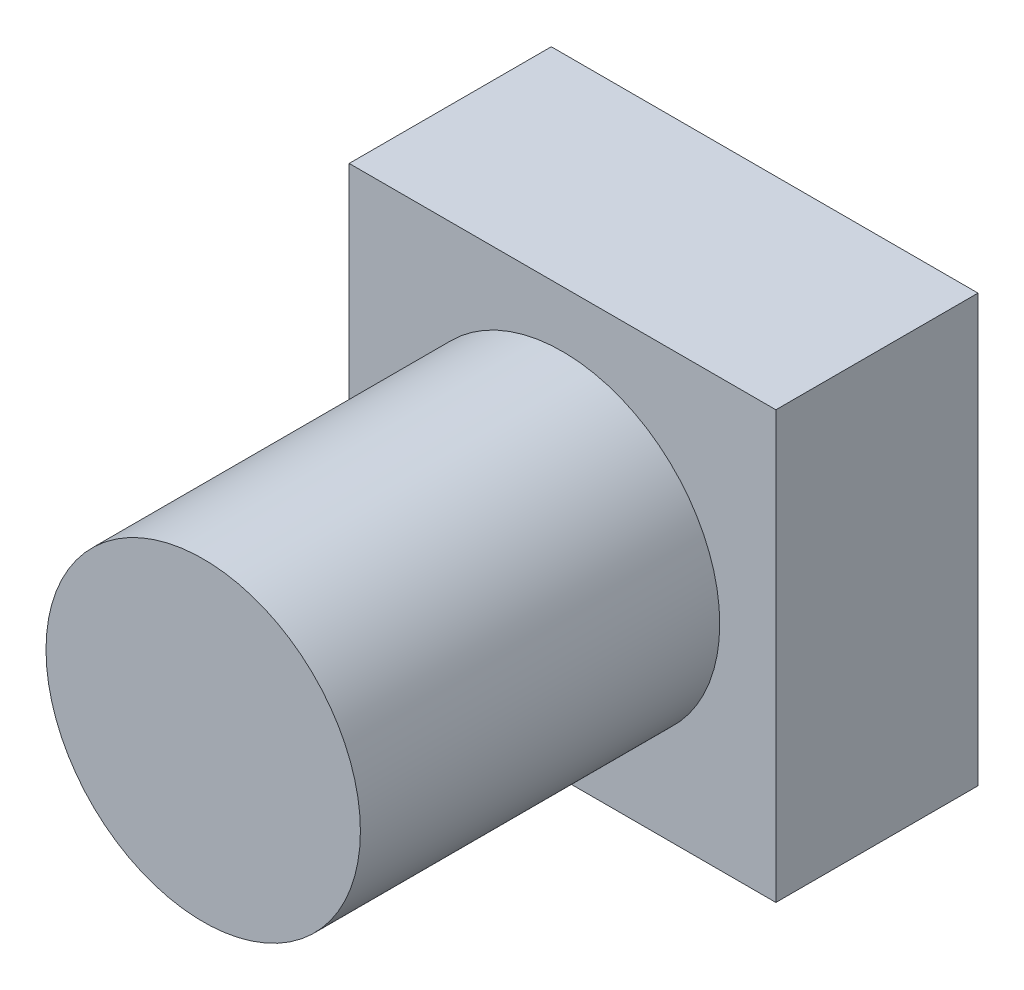
ISO-10303-21;
HEADER;
FILE_DESCRIPTION(('STEP AP214'),'2;1');
FILE_NAME('part.step','',(''),(''),'','','');
FILE_SCHEMA(('AUTOMOTIVE_DESIGN { 1 0 10303 214 1 1 1 1 }'));
ENDSEC;
DATA;
#1=APPLICATION_CONTEXT('core data for automotive mechanical design processes');
#2=APPLICATION_PROTOCOL_DEFINITION('international standard','automotive_design',2000,#1);
#3=PRODUCT_CONTEXT('',#1,'mechanical');
#4=PRODUCT('Part','Part','',(#3));
#5=PRODUCT_RELATED_PRODUCT_CATEGORY('part','',(#4));
#6=PRODUCT_DEFINITION_FORMATION('','',#4);
#7=PRODUCT_DEFINITION_CONTEXT('part definition',#1,'design');
#8=PRODUCT_DEFINITION('design','',#6,#7);
#9=PRODUCT_DEFINITION_SHAPE('','',#8);
#10=(LENGTH_UNIT() NAMED_UNIT(*) SI_UNIT(.MILLI.,.METRE.));
#11=(NAMED_UNIT(*) PLANE_ANGLE_UNIT() SI_UNIT($,.RADIAN.));
#12=(NAMED_UNIT(*) SI_UNIT($,.STERADIAN.) SOLID_ANGLE_UNIT());
#13=UNCERTAINTY_MEASURE_WITH_UNIT(LENGTH_MEASURE(1.E-05),#10,'distance_accuracy_value','');
#14=(GEOMETRIC_REPRESENTATION_CONTEXT(3) GLOBAL_UNCERTAINTY_ASSIGNED_CONTEXT((#13)) GLOBAL_UNIT_ASSIGNED_CONTEXT((#10,
#11,#12)) REPRESENTATION_CONTEXT('',''));
#15=CARTESIAN_POINT('',(0.,0.,0.));
#16=DIRECTION('',(0.,0.,1.));
#17=DIRECTION('',(1.,0.,0.));
#18=AXIS2_PLACEMENT_3D('',#15,#16,#17);
#19=CARTESIAN_POINT('',(0.,0.,9.));
#20=DIRECTION('',(0.,0.,1.));
#21=DIRECTION('',(1.,0.,0.));
#22=AXIS2_PLACEMENT_3D('',#19,#20,#21);
#23=PLANE('',#22);
#24=DIRECTION('',(-1.,0.,0.));
#25=VECTOR('',#24,1.);
#26=CARTESIAN_POINT('',(0.,-9.5,9.));
#27=LINE('',#26,#25);
#28=CARTESIAN_POINT('',(9.5,-9.5,9.));
#29=VERTEX_POINT('',#28);
#30=CARTESIAN_POINT('',(-9.5,-9.5,9.));
#31=VERTEX_POINT('',#30);
#32=EDGE_CURVE('P0_E11',#29,#31,#27,.T.);
#33=ORIENTED_EDGE('',*,*,#32,.F.);
#34=DIRECTION('',(0.,-1.,0.));
#35=VECTOR('',#34,1.);
#36=CARTESIAN_POINT('',(9.5,0.,9.));
#37=LINE('',#36,#35);
#38=CARTESIAN_POINT('',(9.5,9.5,9.));
#39=VERTEX_POINT('',#38);
#40=EDGE_CURVE('P0_E61',#39,#29,#37,.T.);
#41=ORIENTED_EDGE('',*,*,#40,.F.);
#42=DIRECTION('',(1.,0.,0.));
#43=VECTOR('',#42,1.);
#44=CARTESIAN_POINT('',(0.,9.5,9.));
#45=LINE('',#44,#43);
#46=CARTESIAN_POINT('',(-9.5,9.5,9.));
#47=VERTEX_POINT('',#46);
#48=EDGE_CURVE('P0_E87',#47,#39,#45,.T.);
#49=ORIENTED_EDGE('',*,*,#48,.F.);
#50=DIRECTION('',(0.,1.,0.));
#51=VECTOR('',#50,1.);
#52=CARTESIAN_POINT('',(-9.5,0.,9.));
#53=LINE('',#52,#51);
#54=EDGE_CURVE('P0_E24',#31,#47,#53,.T.);
#55=ORIENTED_EDGE('',*,*,#54,.F.);
#56=EDGE_LOOP('',(#33,#41,#49,#55));
#57=FACE_BOUND('',#56,.T.);
#58=ADVANCED_FACE('P0_F17',(#57),#23,.T.);
#59=CARTESIAN_POINT('',(0.,-9.5,0.));
#60=DIRECTION('',(0.,-1.,0.));
#61=DIRECTION('',(0.,0.,-1.));
#62=AXIS2_PLACEMENT_3D('',#59,#60,#61);
#63=PLANE('',#62);
#64=DIRECTION('',(0.,0.,1.));
#65=VECTOR('',#64,1.);
#66=CARTESIAN_POINT('',(9.5,-9.5,0.));
#67=LINE('',#66,#65);
#68=CARTESIAN_POINT('',(9.5,-9.5,0.));
#69=VERTEX_POINT('',#68);
#70=EDGE_CURVE('P0_E53',#69,#29,#67,.T.);
#71=ORIENTED_EDGE('',*,*,#70,.T.);
#72=ORIENTED_EDGE('',*,*,#32,.T.);
#73=DIRECTION('',(0.,0.,1.));
#74=VECTOR('',#73,1.);
#75=CARTESIAN_POINT('',(-9.5,-9.5,0.));
#76=LINE('',#75,#74);
#77=CARTESIAN_POINT('',(-9.5,-9.5,0.));
#78=VERTEX_POINT('',#77);
#79=EDGE_CURVE('P0_E70',#78,#31,#76,.T.);
#80=ORIENTED_EDGE('',*,*,#79,.F.);
#81=DIRECTION('',(1.,0.,0.));
#82=VECTOR('',#81,1.);
#83=CARTESIAN_POINT('',(0.,-9.5,0.));
#84=LINE('',#83,#82);
#85=EDGE_CURVE('P0_E65',#78,#69,#84,.T.);
#86=ORIENTED_EDGE('',*,*,#85,.T.);
#87=EDGE_LOOP('',(#71,#72,#80,#86));
#88=FACE_BOUND('',#87,.T.);
#89=ADVANCED_FACE('P0_F66',(#88),#63,.T.);
#90=CARTESIAN_POINT('',(-9.5,0.,0.));
#91=DIRECTION('',(-1.,0.,0.));
#92=DIRECTION('',(0.,0.,1.));
#93=AXIS2_PLACEMENT_3D('',#90,#91,#92);
#94=PLANE('',#93);
#95=ORIENTED_EDGE('',*,*,#79,.T.);
#96=ORIENTED_EDGE('',*,*,#54,.T.);
#97=DIRECTION('',(0.,0.,1.));
#98=VECTOR('',#97,1.);
#99=CARTESIAN_POINT('',(-9.5,9.5,0.));
#100=LINE('',#99,#98);
#101=CARTESIAN_POINT('',(-9.5,9.5,0.));
#102=VERTEX_POINT('',#101);
#103=EDGE_CURVE('P0_E85',#102,#47,#100,.T.);
#104=ORIENTED_EDGE('',*,*,#103,.F.);
#105=DIRECTION('',(0.,-1.,0.));
#106=VECTOR('',#105,1.);
#107=CARTESIAN_POINT('',(-9.5,0.,0.));
#108=LINE('',#107,#106);
#109=EDGE_CURVE('P0_E75',#102,#78,#108,.T.);
#110=ORIENTED_EDGE('',*,*,#109,.T.);
#111=EDGE_LOOP('',(#95,#96,#104,#110));
#112=FACE_BOUND('',#111,.T.);
#113=ADVANCED_FACE('P0_F93',(#112),#94,.T.);
#114=CARTESIAN_POINT('',(0.,9.5,0.));
#115=DIRECTION('',(0.,1.,0.));
#116=DIRECTION('',(0.,0.,1.));
#117=AXIS2_PLACEMENT_3D('',#114,#115,#116);
#118=PLANE('',#117);
#119=ORIENTED_EDGE('',*,*,#103,.T.);
#120=ORIENTED_EDGE('',*,*,#48,.T.);
#121=DIRECTION('',(0.,0.,1.));
#122=VECTOR('',#121,1.);
#123=CARTESIAN_POINT('',(9.5,9.5,0.));
#124=LINE('',#123,#122);
#125=CARTESIAN_POINT('',(9.5,9.5,0.));
#126=VERTEX_POINT('',#125);
#127=EDGE_CURVE('P0_E62',#126,#39,#124,.T.);
#128=ORIENTED_EDGE('',*,*,#127,.F.);
#129=DIRECTION('',(-1.,0.,0.));
#130=VECTOR('',#129,1.);
#131=CARTESIAN_POINT('',(0.,9.5,0.));
#132=LINE('',#131,#130);
#133=EDGE_CURVE('P0_E76',#126,#102,#132,.T.);
#134=ORIENTED_EDGE('',*,*,#133,.T.);
#135=EDGE_LOOP('',(#119,#120,#128,#134));
#136=FACE_BOUND('',#135,.T.);
#137=ADVANCED_FACE('P0_F90',(#136),#118,.T.);
#138=CARTESIAN_POINT('',(0.,0.,0.));
#139=DIRECTION('',(0.,0.,-1.));
#140=DIRECTION('',(-1.,0.,0.));
#141=AXIS2_PLACEMENT_3D('',#138,#139,#140);
#142=PLANE('',#141);
#143=DIRECTION('',(0.,1.,0.));
#144=VECTOR('',#143,1.);
#145=CARTESIAN_POINT('',(9.5,0.,0.));
#146=LINE('',#145,#144);
#147=EDGE_CURVE('P0_E56',#69,#126,#146,.T.);
#148=ORIENTED_EDGE('',*,*,#147,.F.);
#149=ORIENTED_EDGE('',*,*,#85,.F.);
#150=ORIENTED_EDGE('',*,*,#109,.F.);
#151=ORIENTED_EDGE('',*,*,#133,.F.);
#152=EDGE_LOOP('',(#148,#149,#150,#151));
#153=FACE_BOUND('',#152,.T.);
#154=ADVANCED_FACE('P0_F72',(#153),#142,.T.);
#155=CARTESIAN_POINT('',(9.5,0.,0.));
#156=DIRECTION('',(1.,0.,0.));
#157=DIRECTION('',(0.,0.,-1.));
#158=AXIS2_PLACEMENT_3D('',#155,#156,#157);
#159=PLANE('',#158);
#160=ORIENTED_EDGE('',*,*,#147,.T.);
#161=ORIENTED_EDGE('',*,*,#127,.T.);
#162=ORIENTED_EDGE('',*,*,#40,.T.);
#163=ORIENTED_EDGE('',*,*,#70,.F.);
#164=EDGE_LOOP('',(#160,#161,#162,#163));
#165=FACE_BOUND('',#164,.T.);
#166=ADVANCED_FACE('P0_F57',(#165),#159,.T.);
#167=CLOSED_SHELL('',(#58,#89,#113,#137,#154,#166));
#168=MANIFOLD_SOLID_BREP('P0_B1',#167);
#169=CARTESIAN_POINT('',(0.,0.,25.));
#170=DIRECTION('',(0.,0.,1.));
#171=DIRECTION('',(1.,0.,0.));
#172=AXIS2_PLACEMENT_3D('',#169,#170,#171);
#173=PLANE('',#172);
#174=CARTESIAN_POINT('',(0.,0.,25.));
#175=DIRECTION('',(0.,0.,-1.));
#176=DIRECTION('',(-1.,0.,0.));
#177=AXIS2_PLACEMENT_3D('',#174,#175,#176);
#178=CIRCLE('',#177,7.);
#179=CARTESIAN_POINT('',(-7.,0.,25.));
#180=VERTEX_POINT('',#179);
#181=EDGE_CURVE('P1_E10',#180,#180,#178,.T.);
#182=ORIENTED_EDGE('',*,*,#181,.F.);
#183=EDGE_LOOP('',(#182));
#184=FACE_BOUND('',#183,.T.);
#185=ADVANCED_FACE('P1_F15',(#184),#173,.T.);
#186=CARTESIAN_POINT('',(0.,0.,9.));
#187=DIRECTION('',(0.,0.,-1.));
#188=DIRECTION('',(-1.,0.,0.));
#189=AXIS2_PLACEMENT_3D('',#186,#187,#188);
#190=PLANE('',#189);
#191=CARTESIAN_POINT('',(0.,0.,9.));
#192=DIRECTION('',(0.,0.,1.));
#193=DIRECTION('',(1.,0.,0.));
#194=AXIS2_PLACEMENT_3D('',#191,#192,#193);
#195=CIRCLE('',#194,7.);
#196=CARTESIAN_POINT('',(7.,0.,9.));
#197=VERTEX_POINT('',#196);
#198=EDGE_CURVE('P1_E22',#197,#197,#195,.T.);
#199=ORIENTED_EDGE('',*,*,#198,.F.);
#200=EDGE_LOOP('',(#199));
#201=FACE_BOUND('',#200,.T.);
#202=ADVANCED_FACE('P1_F26',(#201),#190,.T.);
#203=CARTESIAN_POINT('',(0.,0.,9.));
#204=DIRECTION('',(0.,0.,1.));
#205=DIRECTION('',(1.,0.,0.));
#206=AXIS2_PLACEMENT_3D('',#203,#204,#205);
#207=CYLINDRICAL_SURFACE('',#206,7.);
#208=ORIENTED_EDGE('',*,*,#181,.T.);
#209=EDGE_LOOP('',(#208));
#210=FACE_BOUND('',#209,.T.);
#211=ORIENTED_EDGE('',*,*,#198,.T.);
#212=EDGE_LOOP('',(#211));
#213=FACE_BOUND('',#212,.T.);
#214=ADVANCED_FACE('P1_F17',(#210,#213),#207,.T.);
#215=CLOSED_SHELL('',(#185,#202,#214));
#216=MANIFOLD_SOLID_BREP('P1_B1',#215);
#217=ADVANCED_BREP_SHAPE_REPRESENTATION('',(#18,#168,#216),#14);
#218=SHAPE_DEFINITION_REPRESENTATION(#9,#217);
ENDSEC;
END-ISO-10303-21;
